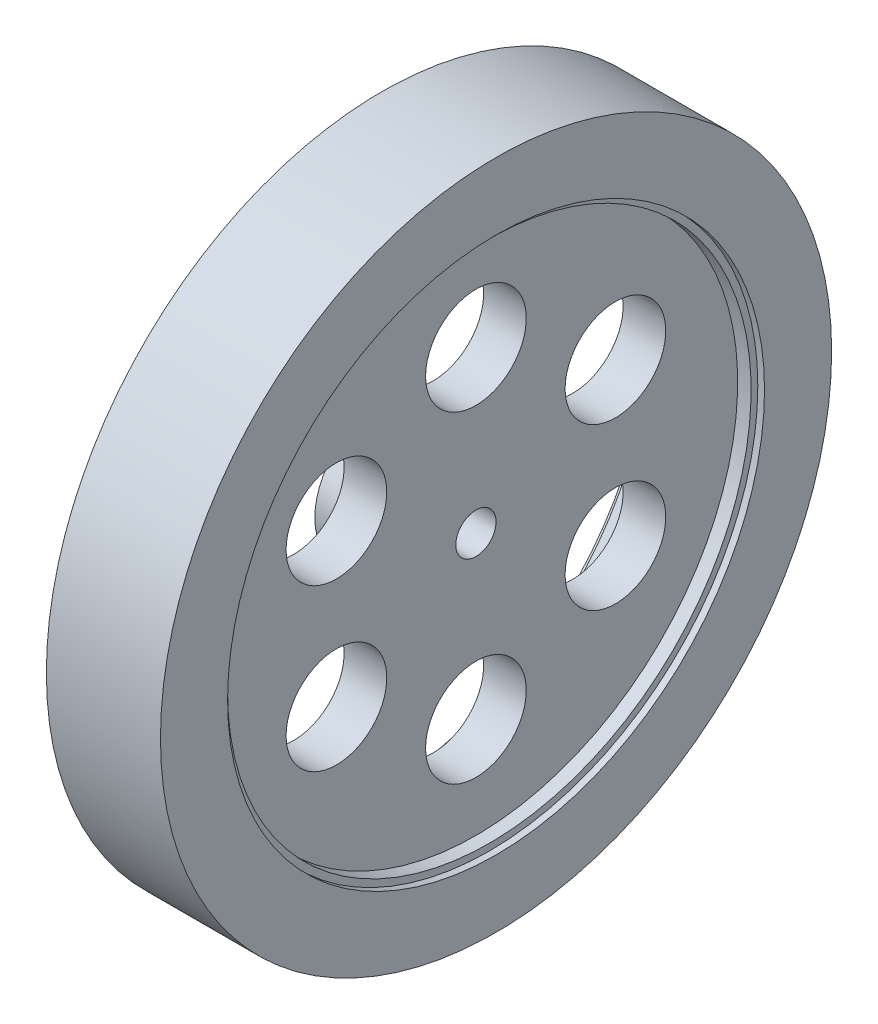
ISO-10303-21;
HEADER;
FILE_DESCRIPTION(('STEP AP214'),'2;1');
FILE_NAME('part.step','',(''),(''),'','','');
FILE_SCHEMA(('AUTOMOTIVE_DESIGN { 1 0 10303 214 1 1 1 1 }'));
ENDSEC;
DATA;
#1=APPLICATION_CONTEXT('core data for automotive mechanical design processes');
#2=APPLICATION_PROTOCOL_DEFINITION('international standard','automotive_design',2000,#1);
#3=PRODUCT_CONTEXT('',#1,'mechanical');
#4=PRODUCT('Part','Part','',(#3));
#5=PRODUCT_RELATED_PRODUCT_CATEGORY('part','',(#4));
#6=PRODUCT_DEFINITION_FORMATION('','',#4);
#7=PRODUCT_DEFINITION_CONTEXT('part definition',#1,'design');
#8=PRODUCT_DEFINITION('design','',#6,#7);
#9=PRODUCT_DEFINITION_SHAPE('','',#8);
#10=(LENGTH_UNIT() NAMED_UNIT(*) SI_UNIT(.MILLI.,.METRE.));
#11=(NAMED_UNIT(*) PLANE_ANGLE_UNIT() SI_UNIT($,.RADIAN.));
#12=(NAMED_UNIT(*) SI_UNIT($,.STERADIAN.) SOLID_ANGLE_UNIT());
#13=UNCERTAINTY_MEASURE_WITH_UNIT(LENGTH_MEASURE(1.E-05),#10,'distance_accuracy_value','');
#14=(GEOMETRIC_REPRESENTATION_CONTEXT(3) GLOBAL_UNCERTAINTY_ASSIGNED_CONTEXT((#13)) GLOBAL_UNIT_ASSIGNED_CONTEXT((#10,
#11,#12)) REPRESENTATION_CONTEXT('',''));
#15=CARTESIAN_POINT('',(0.,0.,0.));
#16=DIRECTION('',(0.,0.,1.));
#17=DIRECTION('',(1.,0.,0.));
#18=AXIS2_PLACEMENT_3D('',#15,#16,#17);
#19=CARTESIAN_POINT('',(-3.175,19.5,0.));
#20=DIRECTION('',(1.,0.,0.));
#21=DIRECTION('',(0.,0.,-1.));
#22=AXIS2_PLACEMENT_3D('',#19,#20,#21);
#23=PLANE('',#22);
#24=CARTESIAN_POINT('',(-3.175,6.00000000000044,10.3923048454135));
#25=DIRECTION('',(-1.,0.,0.));
#26=DIRECTION('',(0.,0.,1.));
#27=AXIS2_PLACEMENT_3D('',#24,#25,#26);
#28=CIRCLE('',#27,3.75000000000014);
#29=CARTESIAN_POINT('',(-3.175,6.00000000000044,14.1423048454137));
#30=VERTEX_POINT('',#29);
#31=EDGE_CURVE('E303',#30,#30,#28,.T.);
#32=ORIENTED_EDGE('',*,*,#31,.F.);
#33=EDGE_LOOP('',(#32));
#34=FACE_BOUND('',#33,.T.);
#35=CARTESIAN_POINT('',(-3.175,-5.99999999999956,10.392304845414));
#36=DIRECTION('',(-1.,0.,0.));
#37=DIRECTION('',(0.,0.,1.));
#38=AXIS2_PLACEMENT_3D('',#35,#36,#37);
#39=CIRCLE('',#38,3.75000000000066);
#40=CARTESIAN_POINT('',(-3.175,-5.99999999999956,14.1423048454147));
#41=VERTEX_POINT('',#40);
#42=EDGE_CURVE('E305',#41,#41,#39,.T.);
#43=ORIENTED_EDGE('',*,*,#42,.F.);
#44=EDGE_LOOP('',(#43));
#45=FACE_BOUND('',#44,.T.);
#46=CARTESIAN_POINT('',(-3.175,-12.,1.01877281101761E-12));
#47=DIRECTION('',(-1.,0.,0.));
#48=DIRECTION('',(0.,0.,1.));
#49=AXIS2_PLACEMENT_3D('',#46,#47,#48);
#50=CIRCLE('',#49,3.75000000000105);
#51=CARTESIAN_POINT('',(-3.175,-12.,3.75000000000207));
#52=VERTEX_POINT('',#51);
#53=EDGE_CURVE('E311',#52,#52,#50,.T.);
#54=ORIENTED_EDGE('',*,*,#53,.F.);
#55=EDGE_LOOP('',(#54));
#56=FACE_BOUND('',#55,.T.);
#57=CARTESIAN_POINT('',(-3.175,5.99999999999955,-10.392304845413));
#58=DIRECTION('',(-1.,0.,0.));
#59=DIRECTION('',(0.,0.,1.));
#60=AXIS2_PLACEMENT_3D('',#57,#58,#59);
#61=CIRCLE('',#60,3.75000000000051);
#62=CARTESIAN_POINT('',(-3.175,5.99999999999955,-6.6423048454125));
#63=VERTEX_POINT('',#62);
#64=EDGE_CURVE('E314',#63,#63,#61,.T.);
#65=ORIENTED_EDGE('',*,*,#64,.F.);
#66=EDGE_LOOP('',(#65));
#67=FACE_BOUND('',#66,.T.);
#68=CARTESIAN_POINT('',(-3.175,12.,0.));
#69=DIRECTION('',(-1.,0.,0.));
#70=DIRECTION('',(0.,0.,1.));
#71=AXIS2_PLACEMENT_3D('',#68,#69,#70);
#72=CIRCLE('',#71,3.75);
#73=CARTESIAN_POINT('',(-3.175,12.,3.75));
#74=VERTEX_POINT('',#73);
#75=EDGE_CURVE('E60',#74,#74,#72,.T.);
#76=ORIENTED_EDGE('',*,*,#75,.F.);
#77=EDGE_LOOP('',(#76));
#78=FACE_BOUND('',#77,.T.);
#79=CARTESIAN_POINT('',(-3.175,0.,0.));
#80=DIRECTION('',(-1.,0.,0.));
#81=DIRECTION('',(0.,0.,1.));
#82=AXIS2_PLACEMENT_3D('',#79,#80,#81);
#83=CIRCLE('',#82,5.);
#84=CARTESIAN_POINT('',(-3.175,0.,5.));
#85=VERTEX_POINT('',#84);
#86=EDGE_CURVE('E101',#85,#85,#83,.T.);
#87=ORIENTED_EDGE('',*,*,#86,.F.);
#88=EDGE_LOOP('',(#87));
#89=FACE_BOUND('',#88,.T.);
#90=CARTESIAN_POINT('',(-3.175,0.,0.));
#91=DIRECTION('',(-1.,0.,0.));
#92=DIRECTION('',(0.,0.,1.));
#93=AXIS2_PLACEMENT_3D('',#90,#91,#92);
#94=CIRCLE('',#93,19.5);
#95=CARTESIAN_POINT('',(-3.175,0.,19.5));
#96=VERTEX_POINT('',#95);
#97=EDGE_CURVE('E105',#96,#96,#94,.T.);
#98=ORIENTED_EDGE('',*,*,#97,.T.);
#99=EDGE_LOOP('',(#98));
#100=FACE_BOUND('',#99,.T.);
#101=CARTESIAN_POINT('',(-3.175,-6.00000000000045,-10.3923048454125));
#102=DIRECTION('',(-1.,0.,0.));
#103=DIRECTION('',(0.,0.,1.));
#104=AXIS2_PLACEMENT_3D('',#101,#102,#103);
#105=CIRCLE('',#104,3.75000000000097);
#106=CARTESIAN_POINT('',(-3.175,-6.00000000000045,-6.64230484541153));
#107=VERTEX_POINT('',#106);
#108=EDGE_CURVE('E318',#107,#107,#105,.T.);
#109=ORIENTED_EDGE('',*,*,#108,.F.);
#110=EDGE_LOOP('',(#109));
#111=FACE_BOUND('',#110,.T.);
#112=ADVANCED_FACE('F36',(#34,#45,#56,#67,#78,#89,#100,#111),#23,.F.);
#113=CARTESIAN_POINT('',(-3.175,0.,0.));
#114=DIRECTION('',(-1.,0.,0.));
#115=DIRECTION('',(0.,0.,1.));
#116=AXIS2_PLACEMENT_3D('',#113,#114,#115);
#117=CYLINDRICAL_SURFACE('',#116,19.5);
#118=CARTESIAN_POINT('',(0.999999999999998,0.,0.));
#119=DIRECTION('',(-1.,0.,0.));
#120=DIRECTION('',(0.,0.,1.));
#121=AXIS2_PLACEMENT_3D('',#118,#119,#120);
#122=CIRCLE('',#121,19.5);
#123=CARTESIAN_POINT('',(0.999999999999998,0.,19.5));
#124=VERTEX_POINT('',#123);
#125=EDGE_CURVE('E10',#124,#124,#122,.T.);
#126=ORIENTED_EDGE('',*,*,#125,.F.);
#127=EDGE_LOOP('',(#126));
#128=FACE_BOUND('',#127,.T.);
#129=CARTESIAN_POINT('',(0.,0.,0.));
#130=DIRECTION('',(-1.,0.,0.));
#131=DIRECTION('',(0.,0.,1.));
#132=AXIS2_PLACEMENT_3D('',#129,#130,#131);
#133=CIRCLE('',#132,19.5);
#134=CARTESIAN_POINT('',(0.,0.,19.5));
#135=VERTEX_POINT('',#134);
#136=EDGE_CURVE('E78',#135,#135,#133,.T.);
#137=ORIENTED_EDGE('',*,*,#136,.T.);
#138=EDGE_LOOP('',(#137));
#139=FACE_BOUND('',#138,.T.);
#140=ADVANCED_FACE('F38',(#128,#139),#117,.F.);
#141=CARTESIAN_POINT('',(0.999999999999999,19.5,0.));
#142=DIRECTION('',(-1.,0.,0.));
#143=DIRECTION('',(0.,0.,1.));
#144=AXIS2_PLACEMENT_3D('',#141,#142,#143);
#145=PLANE('',#144);
#146=CARTESIAN_POINT('',(0.999999999999998,0.,0.));
#147=DIRECTION('',(-1.,0.,0.));
#148=DIRECTION('',(0.,0.,1.));
#149=AXIS2_PLACEMENT_3D('',#146,#147,#148);
#150=CIRCLE('',#149,20.);
#151=CARTESIAN_POINT('',(0.999999999999998,0.,20.));
#152=VERTEX_POINT('',#151);
#153=EDGE_CURVE('E45',#152,#152,#150,.T.);
#154=ORIENTED_EDGE('',*,*,#153,.F.);
#155=EDGE_LOOP('',(#154));
#156=FACE_BOUND('',#155,.T.);
#157=ORIENTED_EDGE('',*,*,#125,.T.);
#158=EDGE_LOOP('',(#157));
#159=FACE_BOUND('',#158,.T.);
#160=ADVANCED_FACE('F137',(#156,#159),#145,.F.);
#161=CARTESIAN_POINT('',(-3.175,0.,0.));
#162=DIRECTION('',(-1.,0.,0.));
#163=DIRECTION('',(0.,0.,1.));
#164=AXIS2_PLACEMENT_3D('',#161,#162,#163);
#165=CYLINDRICAL_SURFACE('',#164,20.);
#166=CARTESIAN_POINT('',(1.5,0.,0.));
#167=DIRECTION('',(-1.,0.,0.));
#168=DIRECTION('',(0.,0.,1.));
#169=AXIS2_PLACEMENT_3D('',#166,#167,#168);
#170=CIRCLE('',#169,20.);
#171=CARTESIAN_POINT('',(1.5,0.,20.));
#172=VERTEX_POINT('',#171);
#173=EDGE_CURVE('E51',#172,#172,#170,.T.);
#174=ORIENTED_EDGE('',*,*,#173,.F.);
#175=EDGE_LOOP('',(#174));
#176=FACE_BOUND('',#175,.T.);
#177=ORIENTED_EDGE('',*,*,#153,.T.);
#178=EDGE_LOOP('',(#177));
#179=FACE_BOUND('',#178,.T.);
#180=ADVANCED_FACE('F134',(#176,#179),#165,.F.);
#181=CARTESIAN_POINT('',(1.5,20.,0.));
#182=DIRECTION('',(-1.,0.,0.));
#183=DIRECTION('',(0.,0.,1.));
#184=AXIS2_PLACEMENT_3D('',#181,#182,#183);
#185=PLANE('',#184);
#186=CARTESIAN_POINT('',(1.5,0.,0.));
#187=DIRECTION('',(-1.,0.,0.));
#188=DIRECTION('',(0.,0.,1.));
#189=AXIS2_PLACEMENT_3D('',#186,#187,#188);
#190=CIRCLE('',#189,25.);
#191=CARTESIAN_POINT('',(1.5,0.,25.));
#192=VERTEX_POINT('',#191);
#193=EDGE_CURVE('E125',#192,#192,#190,.T.);
#194=ORIENTED_EDGE('',*,*,#193,.F.);
#195=EDGE_LOOP('',(#194));
#196=FACE_BOUND('',#195,.T.);
#197=ORIENTED_EDGE('',*,*,#173,.T.);
#198=EDGE_LOOP('',(#197));
#199=FACE_BOUND('',#198,.T.);
#200=ADVANCED_FACE('F132',(#196,#199),#185,.F.);
#201=CARTESIAN_POINT('',(-3.175,0.,0.));
#202=DIRECTION('',(-1.,0.,0.));
#203=DIRECTION('',(0.,0.,1.));
#204=AXIS2_PLACEMENT_3D('',#201,#202,#203);
#205=CYLINDRICAL_SURFACE('',#204,25.);
#206=CARTESIAN_POINT('',(-7.,0.,0.));
#207=DIRECTION('',(-1.,0.,0.));
#208=DIRECTION('',(0.,0.,1.));
#209=AXIS2_PLACEMENT_3D('',#206,#207,#208);
#210=CIRCLE('',#209,25.);
#211=CARTESIAN_POINT('',(-7.,0.,25.));
#212=VERTEX_POINT('',#211);
#213=EDGE_CURVE('E121',#212,#212,#210,.T.);
#214=ORIENTED_EDGE('',*,*,#213,.F.);
#215=EDGE_LOOP('',(#214));
#216=FACE_BOUND('',#215,.T.);
#217=ORIENTED_EDGE('',*,*,#193,.T.);
#218=EDGE_LOOP('',(#217));
#219=FACE_BOUND('',#218,.T.);
#220=ADVANCED_FACE('F174',(#216,#219),#205,.T.);
#221=CARTESIAN_POINT('',(-7.,25.,0.));
#222=DIRECTION('',(1.,0.,0.));
#223=DIRECTION('',(0.,0.,-1.));
#224=AXIS2_PLACEMENT_3D('',#221,#222,#223);
#225=PLANE('',#224);
#226=CARTESIAN_POINT('',(-7.,0.,0.));
#227=DIRECTION('',(-1.,0.,0.));
#228=DIRECTION('',(0.,0.,1.));
#229=AXIS2_PLACEMENT_3D('',#226,#227,#228);
#230=CIRCLE('',#229,20.);
#231=CARTESIAN_POINT('',(-7.,0.,20.));
#232=VERTEX_POINT('',#231);
#233=EDGE_CURVE('E117',#232,#232,#230,.T.);
#234=ORIENTED_EDGE('',*,*,#233,.F.);
#235=EDGE_LOOP('',(#234));
#236=FACE_BOUND('',#235,.T.);
#237=ORIENTED_EDGE('',*,*,#213,.T.);
#238=EDGE_LOOP('',(#237));
#239=FACE_BOUND('',#238,.T.);
#240=ADVANCED_FACE('F170',(#236,#239),#225,.F.);
#241=CARTESIAN_POINT('',(-3.175,0.,0.));
#242=DIRECTION('',(-1.,0.,0.));
#243=DIRECTION('',(0.,0.,1.));
#244=AXIS2_PLACEMENT_3D('',#241,#242,#243);
#245=CYLINDRICAL_SURFACE('',#244,20.);
#246=CARTESIAN_POINT('',(-6.5,0.,0.));
#247=DIRECTION('',(-1.,0.,0.));
#248=DIRECTION('',(0.,0.,1.));
#249=AXIS2_PLACEMENT_3D('',#246,#247,#248);
#250=CIRCLE('',#249,20.);
#251=CARTESIAN_POINT('',(-6.5,0.,20.));
#252=VERTEX_POINT('',#251);
#253=EDGE_CURVE('E113',#252,#252,#250,.T.);
#254=ORIENTED_EDGE('',*,*,#253,.F.);
#255=EDGE_LOOP('',(#254));
#256=FACE_BOUND('',#255,.T.);
#257=ORIENTED_EDGE('',*,*,#233,.T.);
#258=EDGE_LOOP('',(#257));
#259=FACE_BOUND('',#258,.T.);
#260=ADVANCED_FACE('F166',(#256,#259),#245,.F.);
#261=CARTESIAN_POINT('',(-6.5,20.,0.));
#262=DIRECTION('',(1.,0.,0.));
#263=DIRECTION('',(0.,0.,-1.));
#264=AXIS2_PLACEMENT_3D('',#261,#262,#263);
#265=PLANE('',#264);
#266=CARTESIAN_POINT('',(-6.5,0.,0.));
#267=DIRECTION('',(-1.,0.,0.));
#268=DIRECTION('',(0.,0.,1.));
#269=AXIS2_PLACEMENT_3D('',#266,#267,#268);
#270=CIRCLE('',#269,19.5);
#271=CARTESIAN_POINT('',(-6.5,0.,19.5));
#272=VERTEX_POINT('',#271);
#273=EDGE_CURVE('E109',#272,#272,#270,.T.);
#274=ORIENTED_EDGE('',*,*,#273,.F.);
#275=EDGE_LOOP('',(#274));
#276=FACE_BOUND('',#275,.T.);
#277=ORIENTED_EDGE('',*,*,#253,.T.);
#278=EDGE_LOOP('',(#277));
#279=FACE_BOUND('',#278,.T.);
#280=ADVANCED_FACE('F162',(#276,#279),#265,.F.);
#281=CARTESIAN_POINT('',(-3.175,0.,0.));
#282=DIRECTION('',(-1.,0.,0.));
#283=DIRECTION('',(0.,0.,1.));
#284=AXIS2_PLACEMENT_3D('',#281,#282,#283);
#285=CYLINDRICAL_SURFACE('',#284,19.5);
#286=ORIENTED_EDGE('',*,*,#97,.F.);
#287=EDGE_LOOP('',(#286));
#288=FACE_BOUND('',#287,.T.);
#289=ORIENTED_EDGE('',*,*,#273,.T.);
#290=EDGE_LOOP('',(#289));
#291=FACE_BOUND('',#290,.T.);
#292=ADVANCED_FACE('F159',(#288,#291),#285,.F.);
#293=CARTESIAN_POINT('',(-3.175,0.,0.));
#294=DIRECTION('',(-1.,0.,0.));
#295=DIRECTION('',(0.,0.,1.));
#296=AXIS2_PLACEMENT_3D('',#293,#294,#295);
#297=CYLINDRICAL_SURFACE('',#296,5.);
#298=CARTESIAN_POINT('',(-7.,0.,0.));
#299=DIRECTION('',(-1.,0.,0.));
#300=DIRECTION('',(0.,0.,1.));
#301=AXIS2_PLACEMENT_3D('',#298,#299,#300);
#302=CIRCLE('',#301,5.);
#303=CARTESIAN_POINT('',(-7.,0.,5.));
#304=VERTEX_POINT('',#303);
#305=EDGE_CURVE('E97',#304,#304,#302,.T.);
#306=ORIENTED_EDGE('',*,*,#305,.F.);
#307=EDGE_LOOP('',(#306));
#308=FACE_BOUND('',#307,.T.);
#309=ORIENTED_EDGE('',*,*,#86,.T.);
#310=EDGE_LOOP('',(#309));
#311=FACE_BOUND('',#310,.T.);
#312=ADVANCED_FACE('F157',(#308,#311),#297,.T.);
#313=CARTESIAN_POINT('',(-7.,1.5,0.));
#314=DIRECTION('',(1.,0.,0.));
#315=DIRECTION('',(0.,0.,-1.));
#316=AXIS2_PLACEMENT_3D('',#313,#314,#315);
#317=PLANE('',#316);
#318=CARTESIAN_POINT('',(-7.,0.,0.));
#319=DIRECTION('',(-1.,0.,0.));
#320=DIRECTION('',(0.,0.,1.));
#321=AXIS2_PLACEMENT_3D('',#318,#319,#320);
#322=CIRCLE('',#321,1.5);
#323=CARTESIAN_POINT('',(-7.,0.,1.5));
#324=VERTEX_POINT('',#323);
#325=EDGE_CURVE('E89',#324,#324,#322,.T.);
#326=ORIENTED_EDGE('',*,*,#325,.F.);
#327=EDGE_LOOP('',(#326));
#328=FACE_BOUND('',#327,.T.);
#329=ORIENTED_EDGE('',*,*,#305,.T.);
#330=EDGE_LOOP('',(#329));
#331=FACE_BOUND('',#330,.T.);
#332=ADVANCED_FACE('F213',(#328,#331),#317,.F.);
#333=CARTESIAN_POINT('',(-3.175,0.,0.));
#334=DIRECTION('',(-1.,0.,0.));
#335=DIRECTION('',(0.,0.,1.));
#336=AXIS2_PLACEMENT_3D('',#333,#334,#335);
#337=CYLINDRICAL_SURFACE('',#336,1.5);
#338=CARTESIAN_POINT('',(0.,0.,0.));
#339=DIRECTION('',(-1.,0.,0.));
#340=DIRECTION('',(0.,0.,1.));
#341=AXIS2_PLACEMENT_3D('',#338,#339,#340);
#342=CIRCLE('',#341,1.5);
#343=CARTESIAN_POINT('',(0.,0.,1.5));
#344=VERTEX_POINT('',#343);
#345=EDGE_CURVE('E83',#344,#344,#342,.T.);
#346=ORIENTED_EDGE('',*,*,#345,.F.);
#347=EDGE_LOOP('',(#346));
#348=FACE_BOUND('',#347,.T.);
#349=ORIENTED_EDGE('',*,*,#325,.T.);
#350=EDGE_LOOP('',(#349));
#351=FACE_BOUND('',#350,.T.);
#352=ADVANCED_FACE('F220',(#348,#351),#337,.F.);
#353=CARTESIAN_POINT('',(0.,1.5,0.));
#354=DIRECTION('',(-1.,0.,0.));
#355=DIRECTION('',(0.,0.,1.));
#356=AXIS2_PLACEMENT_3D('',#353,#354,#355);
#357=PLANE('',#356);
#358=CARTESIAN_POINT('',(0.,6.00000000000044,10.3923048454135));
#359=DIRECTION('',(-1.,0.,0.));
#360=DIRECTION('',(0.,0.,1.));
#361=AXIS2_PLACEMENT_3D('',#358,#359,#360);
#362=CIRCLE('',#361,3.75000000000014);
#363=CARTESIAN_POINT('',(0.,6.00000000000044,14.1423048454137));
#364=VERTEX_POINT('',#363);
#365=EDGE_CURVE('E40',#364,#364,#362,.T.);
#366=ORIENTED_EDGE('',*,*,#365,.T.);
#367=EDGE_LOOP('',(#366));
#368=FACE_BOUND('',#367,.T.);
#369=CARTESIAN_POINT('',(0.,-5.99999999999956,10.392304845414));
#370=DIRECTION('',(-1.,0.,0.));
#371=DIRECTION('',(0.,0.,1.));
#372=AXIS2_PLACEMENT_3D('',#369,#370,#371);
#373=CIRCLE('',#372,3.75000000000066);
#374=CARTESIAN_POINT('',(0.,-5.99999999999956,14.1423048454147));
#375=VERTEX_POINT('',#374);
#376=EDGE_CURVE('E71',#375,#375,#373,.T.);
#377=ORIENTED_EDGE('',*,*,#376,.T.);
#378=EDGE_LOOP('',(#377));
#379=FACE_BOUND('',#378,.T.);
#380=CARTESIAN_POINT('',(0.,-12.,1.01877281101761E-12));
#381=DIRECTION('',(-1.,0.,0.));
#382=DIRECTION('',(0.,0.,1.));
#383=AXIS2_PLACEMENT_3D('',#380,#381,#382);
#384=CIRCLE('',#383,3.75000000000105);
#385=CARTESIAN_POINT('',(0.,-12.,3.75000000000207));
#386=VERTEX_POINT('',#385);
#387=EDGE_CURVE('E68',#386,#386,#384,.T.);
#388=ORIENTED_EDGE('',*,*,#387,.T.);
#389=EDGE_LOOP('',(#388));
#390=FACE_BOUND('',#389,.T.);
#391=CARTESIAN_POINT('',(0.,-6.00000000000045,-10.3923048454125));
#392=DIRECTION('',(-1.,0.,0.));
#393=DIRECTION('',(0.,0.,1.));
#394=AXIS2_PLACEMENT_3D('',#391,#392,#393);
#395=CIRCLE('',#394,3.75000000000097);
#396=CARTESIAN_POINT('',(0.,-6.00000000000045,-6.64230484541153));
#397=VERTEX_POINT('',#396);
#398=EDGE_CURVE('E64',#397,#397,#395,.T.);
#399=ORIENTED_EDGE('',*,*,#398,.T.);
#400=EDGE_LOOP('',(#399));
#401=FACE_BOUND('',#400,.T.);
#402=CARTESIAN_POINT('',(0.,5.99999999999955,-10.392304845413));
#403=DIRECTION('',(-1.,0.,0.));
#404=DIRECTION('',(0.,0.,1.));
#405=AXIS2_PLACEMENT_3D('',#402,#403,#404);
#406=CIRCLE('',#405,3.75000000000051);
#407=CARTESIAN_POINT('',(0.,5.99999999999955,-6.6423048454125));
#408=VERTEX_POINT('',#407);
#409=EDGE_CURVE('E59',#408,#408,#406,.T.);
#410=ORIENTED_EDGE('',*,*,#409,.T.);
#411=EDGE_LOOP('',(#410));
#412=FACE_BOUND('',#411,.T.);
#413=CARTESIAN_POINT('',(0.,12.,0.));
#414=DIRECTION('',(-1.,0.,0.));
#415=DIRECTION('',(0.,0.,1.));
#416=AXIS2_PLACEMENT_3D('',#413,#414,#415);
#417=CIRCLE('',#416,3.75);
#418=CARTESIAN_POINT('',(0.,12.,3.75));
#419=VERTEX_POINT('',#418);
#420=EDGE_CURVE('E55',#419,#419,#417,.T.);
#421=ORIENTED_EDGE('',*,*,#420,.T.);
#422=EDGE_LOOP('',(#421));
#423=FACE_BOUND('',#422,.T.);
#424=ORIENTED_EDGE('',*,*,#136,.F.);
#425=EDGE_LOOP('',(#424));
#426=FACE_BOUND('',#425,.T.);
#427=ORIENTED_EDGE('',*,*,#345,.T.);
#428=EDGE_LOOP('',(#427));
#429=FACE_BOUND('',#428,.T.);
#430=ADVANCED_FACE('F226',(#368,#379,#390,#401,#412,#423,#426,#429),#357,.F.);
#431=CARTESIAN_POINT('',(6.825,12.,0.));
#432=DIRECTION('',(-1.,0.,0.));
#433=DIRECTION('',(0.,0.,1.));
#434=AXIS2_PLACEMENT_3D('',#431,#432,#433);
#435=CYLINDRICAL_SURFACE('',#434,3.75);
#436=ORIENTED_EDGE('',*,*,#75,.T.);
#437=EDGE_LOOP('',(#436));
#438=FACE_BOUND('',#437,.T.);
#439=ORIENTED_EDGE('',*,*,#420,.F.);
#440=EDGE_LOOP('',(#439));
#441=FACE_BOUND('',#440,.T.);
#442=ADVANCED_FACE('F234',(#438,#441),#435,.F.);
#443=CARTESIAN_POINT('',(6.825,5.99999999999955,-10.392304845413));
#444=DIRECTION('',(-1.,0.,0.));
#445=DIRECTION('',(0.,0.,1.));
#446=AXIS2_PLACEMENT_3D('',#443,#444,#445);
#447=CYLINDRICAL_SURFACE('',#446,3.75000000000051);
#448=ORIENTED_EDGE('',*,*,#64,.T.);
#449=EDGE_LOOP('',(#448));
#450=FACE_BOUND('',#449,.T.);
#451=ORIENTED_EDGE('',*,*,#409,.F.);
#452=EDGE_LOOP('',(#451));
#453=FACE_BOUND('',#452,.T.);
#454=ADVANCED_FACE('F247',(#450,#453),#447,.F.);
#455=CARTESIAN_POINT('',(6.825,-6.00000000000045,-10.3923048454125));
#456=DIRECTION('',(-1.,0.,0.));
#457=DIRECTION('',(0.,0.,1.));
#458=AXIS2_PLACEMENT_3D('',#455,#456,#457);
#459=CYLINDRICAL_SURFACE('',#458,3.75000000000097);
#460=ORIENTED_EDGE('',*,*,#108,.T.);
#461=EDGE_LOOP('',(#460));
#462=FACE_BOUND('',#461,.T.);
#463=ORIENTED_EDGE('',*,*,#398,.F.);
#464=EDGE_LOOP('',(#463));
#465=FACE_BOUND('',#464,.T.);
#466=ADVANCED_FACE('F254',(#462,#465),#459,.F.);
#467=CARTESIAN_POINT('',(6.825,-12.,1.01877281101761E-12));
#468=DIRECTION('',(-1.,0.,0.));
#469=DIRECTION('',(0.,0.,1.));
#470=AXIS2_PLACEMENT_3D('',#467,#468,#469);
#471=CYLINDRICAL_SURFACE('',#470,3.75000000000105);
#472=ORIENTED_EDGE('',*,*,#53,.T.);
#473=EDGE_LOOP('',(#472));
#474=FACE_BOUND('',#473,.T.);
#475=ORIENTED_EDGE('',*,*,#387,.F.);
#476=EDGE_LOOP('',(#475));
#477=FACE_BOUND('',#476,.T.);
#478=ADVANCED_FACE('F262',(#474,#477),#471,.F.);
#479=CARTESIAN_POINT('',(6.825,-5.99999999999956,10.392304845414));
#480=DIRECTION('',(-1.,0.,0.));
#481=DIRECTION('',(0.,0.,1.));
#482=AXIS2_PLACEMENT_3D('',#479,#480,#481);
#483=CYLINDRICAL_SURFACE('',#482,3.75000000000066);
#484=ORIENTED_EDGE('',*,*,#42,.T.);
#485=EDGE_LOOP('',(#484));
#486=FACE_BOUND('',#485,.T.);
#487=ORIENTED_EDGE('',*,*,#376,.F.);
#488=EDGE_LOOP('',(#487));
#489=FACE_BOUND('',#488,.T.);
#490=ADVANCED_FACE('F270',(#486,#489),#483,.F.);
#491=CARTESIAN_POINT('',(6.825,6.00000000000044,10.3923048454135));
#492=DIRECTION('',(-1.,0.,0.));
#493=DIRECTION('',(0.,0.,1.));
#494=AXIS2_PLACEMENT_3D('',#491,#492,#493);
#495=CYLINDRICAL_SURFACE('',#494,3.75000000000014);
#496=ORIENTED_EDGE('',*,*,#31,.T.);
#497=EDGE_LOOP('',(#496));
#498=FACE_BOUND('',#497,.T.);
#499=ORIENTED_EDGE('',*,*,#365,.F.);
#500=EDGE_LOOP('',(#499));
#501=FACE_BOUND('',#500,.T.);
#502=ADVANCED_FACE('F278',(#498,#501),#495,.F.);
#503=CLOSED_SHELL('',(#112,#140,#160,#180,#200,#220,#240,#260,#280,#292,#312,#332,#352,#430,
#442,#454,#466,#478,#490,#502));
#504=MANIFOLD_SOLID_BREP('B2',#503);
#505=ADVANCED_BREP_SHAPE_REPRESENTATION('',(#18,#504),#14);
#506=SHAPE_DEFINITION_REPRESENTATION(#9,#505);
ENDSEC;
END-ISO-10303-21;
